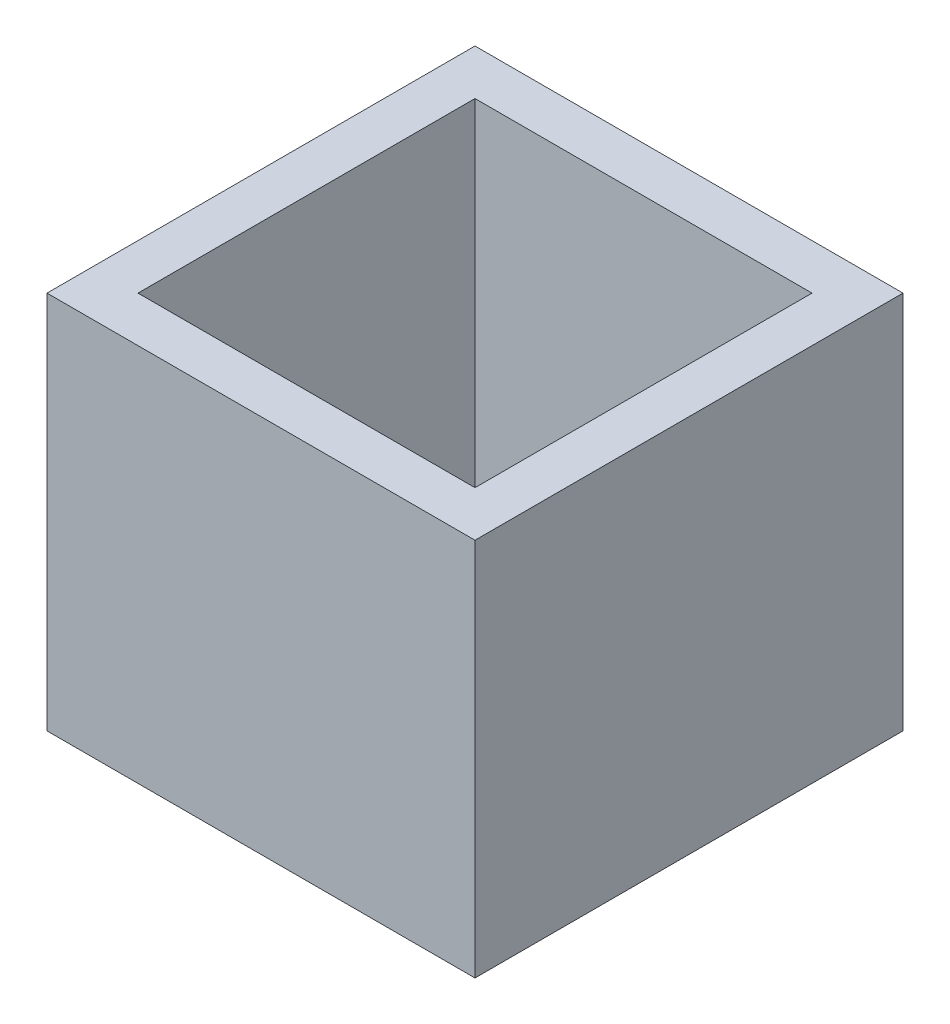
ISO-10303-21;
HEADER;
FILE_DESCRIPTION(('STEP AP214'),'2;1');
FILE_NAME('part.step','',(''),(''),'','','');
FILE_SCHEMA(('AUTOMOTIVE_DESIGN { 1 0 10303 214 1 1 1 1 }'));
ENDSEC;
DATA;
#1=APPLICATION_CONTEXT('core data for automotive mechanical design processes');
#2=APPLICATION_PROTOCOL_DEFINITION('international standard','automotive_design',2000,#1);
#3=PRODUCT_CONTEXT('',#1,'mechanical');
#4=PRODUCT('Part','Part','',(#3));
#5=PRODUCT_RELATED_PRODUCT_CATEGORY('part','',(#4));
#6=PRODUCT_DEFINITION_FORMATION('','',#4);
#7=PRODUCT_DEFINITION_CONTEXT('part definition',#1,'design');
#8=PRODUCT_DEFINITION('design','',#6,#7);
#9=PRODUCT_DEFINITION_SHAPE('','',#8);
#10=(LENGTH_UNIT() NAMED_UNIT(*) SI_UNIT(.MILLI.,.METRE.));
#11=(NAMED_UNIT(*) PLANE_ANGLE_UNIT() SI_UNIT($,.RADIAN.));
#12=(NAMED_UNIT(*) SI_UNIT($,.STERADIAN.) SOLID_ANGLE_UNIT());
#13=UNCERTAINTY_MEASURE_WITH_UNIT(LENGTH_MEASURE(1.E-05),#10,'distance_accuracy_value','');
#14=(GEOMETRIC_REPRESENTATION_CONTEXT(3) GLOBAL_UNCERTAINTY_ASSIGNED_CONTEXT((#13)) GLOBAL_UNIT_ASSIGNED_CONTEXT((#10,
#11,#12)) REPRESENTATION_CONTEXT('',''));
#15=CARTESIAN_POINT('',(0.,0.,0.));
#16=DIRECTION('',(0.,0.,1.));
#17=DIRECTION('',(1.,0.,0.));
#18=AXIS2_PLACEMENT_3D('',#15,#16,#17);
#19=CARTESIAN_POINT('',(10.16,18.,10.16));
#20=DIRECTION('',(-1.,0.,0.));
#21=DIRECTION('',(0.,0.,1.));
#22=AXIS2_PLACEMENT_3D('',#19,#20,#21);
#23=PLANE('',#22);
#24=DIRECTION('',(0.,0.,-1.));
#25=VECTOR('',#24,1.);
#26=CARTESIAN_POINT('',(10.16,0.,10.16));
#27=LINE('',#26,#25);
#28=CARTESIAN_POINT('',(10.16,0.,10.16));
#29=VERTEX_POINT('',#28);
#30=CARTESIAN_POINT('',(10.16,0.,-10.16));
#31=VERTEX_POINT('',#30);
#32=EDGE_CURVE('E143',#29,#31,#27,.T.);
#33=ORIENTED_EDGE('',*,*,#32,.T.);
#34=DIRECTION('',(0.,-1.,0.));
#35=VECTOR('',#34,1.);
#36=CARTESIAN_POINT('',(10.16,18.,-10.16));
#37=LINE('',#36,#35);
#38=CARTESIAN_POINT('',(10.16,18.,-10.16));
#39=VERTEX_POINT('',#38);
#40=EDGE_CURVE('E11',#39,#31,#37,.T.);
#41=ORIENTED_EDGE('',*,*,#40,.F.);
#42=DIRECTION('',(0.,0.,-1.));
#43=VECTOR('',#42,1.);
#44=CARTESIAN_POINT('',(10.16,18.,10.16));
#45=LINE('',#44,#43);
#46=CARTESIAN_POINT('',(10.16,18.,10.16));
#47=VERTEX_POINT('',#46);
#48=EDGE_CURVE('E147',#47,#39,#45,.T.);
#49=ORIENTED_EDGE('',*,*,#48,.F.);
#50=DIRECTION('',(0.,-1.,0.));
#51=VECTOR('',#50,1.);
#52=CARTESIAN_POINT('',(10.16,18.,10.16));
#53=LINE('',#52,#51);
#54=EDGE_CURVE('E153',#47,#29,#53,.T.);
#55=ORIENTED_EDGE('',*,*,#54,.T.);
#56=EDGE_LOOP('',(#33,#41,#49,#55));
#57=FACE_BOUND('',#56,.T.);
#58=ADVANCED_FACE('F35',(#57),#23,.F.);
#59=CARTESIAN_POINT('',(-10.16,18.,-10.16));
#60=DIRECTION('',(0.,0.,1.));
#61=DIRECTION('',(1.,0.,0.));
#62=AXIS2_PLACEMENT_3D('',#59,#60,#61);
#63=PLANE('',#62);
#64=DIRECTION('',(-1.,0.,0.));
#65=VECTOR('',#64,1.);
#66=CARTESIAN_POINT('',(-10.16,0.,-10.16));
#67=LINE('',#66,#65);
#68=CARTESIAN_POINT('',(-10.16,0.,-10.16));
#69=VERTEX_POINT('',#68);
#70=EDGE_CURVE('E156',#31,#69,#67,.T.);
#71=ORIENTED_EDGE('',*,*,#70,.T.);
#72=DIRECTION('',(0.,-1.,0.));
#73=VECTOR('',#72,1.);
#74=CARTESIAN_POINT('',(-10.16,18.,-10.16));
#75=LINE('',#74,#73);
#76=CARTESIAN_POINT('',(-10.16,18.,-10.16));
#77=VERTEX_POINT('',#76);
#78=EDGE_CURVE('E42',#77,#69,#75,.T.);
#79=ORIENTED_EDGE('',*,*,#78,.F.);
#80=DIRECTION('',(-1.,0.,0.));
#81=VECTOR('',#80,1.);
#82=CARTESIAN_POINT('',(-10.16,18.,-10.16));
#83=LINE('',#82,#81);
#84=EDGE_CURVE('E86',#39,#77,#83,.T.);
#85=ORIENTED_EDGE('',*,*,#84,.F.);
#86=ORIENTED_EDGE('',*,*,#40,.T.);
#87=EDGE_LOOP('',(#71,#79,#85,#86));
#88=FACE_BOUND('',#87,.T.);
#89=ADVANCED_FACE('F185',(#88),#63,.F.);
#90=CARTESIAN_POINT('',(-10.16,18.,10.16));
#91=DIRECTION('',(1.,0.,0.));
#92=DIRECTION('',(0.,0.,-1.));
#93=AXIS2_PLACEMENT_3D('',#90,#91,#92);
#94=PLANE('',#93);
#95=DIRECTION('',(0.,0.,1.));
#96=VECTOR('',#95,1.);
#97=CARTESIAN_POINT('',(-10.16,0.,10.16));
#98=LINE('',#97,#96);
#99=CARTESIAN_POINT('',(-10.16,0.,10.16));
#100=VERTEX_POINT('',#99);
#101=EDGE_CURVE('E158',#69,#100,#98,.T.);
#102=ORIENTED_EDGE('',*,*,#101,.T.);
#103=DIRECTION('',(0.,-1.,0.));
#104=VECTOR('',#103,1.);
#105=CARTESIAN_POINT('',(-10.16,18.,10.16));
#106=LINE('',#105,#104);
#107=CARTESIAN_POINT('',(-10.16,18.,10.16));
#108=VERTEX_POINT('',#107);
#109=EDGE_CURVE('E162',#108,#100,#106,.T.);
#110=ORIENTED_EDGE('',*,*,#109,.F.);
#111=DIRECTION('',(0.,0.,1.));
#112=VECTOR('',#111,1.);
#113=CARTESIAN_POINT('',(-10.16,18.,10.16));
#114=LINE('',#113,#112);
#115=EDGE_CURVE('E150',#77,#108,#114,.T.);
#116=ORIENTED_EDGE('',*,*,#115,.F.);
#117=ORIENTED_EDGE('',*,*,#78,.T.);
#118=EDGE_LOOP('',(#102,#110,#116,#117));
#119=FACE_BOUND('',#118,.T.);
#120=ADVANCED_FACE('F167',(#119),#94,.F.);
#121=CARTESIAN_POINT('',(-10.16,18.,10.16));
#122=DIRECTION('',(0.,0.,-1.));
#123=DIRECTION('',(-1.,0.,0.));
#124=AXIS2_PLACEMENT_3D('',#121,#122,#123);
#125=PLANE('',#124);
#126=DIRECTION('',(1.,0.,0.));
#127=VECTOR('',#126,1.);
#128=CARTESIAN_POINT('',(-10.16,0.,10.16));
#129=LINE('',#128,#127);
#130=EDGE_CURVE('E79',#100,#29,#129,.T.);
#131=ORIENTED_EDGE('',*,*,#130,.T.);
#132=ORIENTED_EDGE('',*,*,#54,.F.);
#133=DIRECTION('',(1.,0.,0.));
#134=VECTOR('',#133,1.);
#135=CARTESIAN_POINT('',(-10.16,18.,10.16));
#136=LINE('',#135,#134);
#137=EDGE_CURVE('E58',#108,#47,#136,.T.);
#138=ORIENTED_EDGE('',*,*,#137,.F.);
#139=ORIENTED_EDGE('',*,*,#109,.T.);
#140=EDGE_LOOP('',(#131,#132,#138,#139));
#141=FACE_BOUND('',#140,.T.);
#142=ADVANCED_FACE('F175',(#141),#125,.F.);
#143=CARTESIAN_POINT('',(0.,18.,0.));
#144=DIRECTION('',(0.,-1.,0.));
#145=DIRECTION('',(0.,0.,-1.));
#146=AXIS2_PLACEMENT_3D('',#143,#144,#145);
#147=PLANE('',#146);
#148=DIRECTION('',(-1.,0.,0.));
#149=VECTOR('',#148,1.);
#150=CARTESIAN_POINT('',(-7.999999986,18.,-8.000000018));
#151=LINE('',#150,#149);
#152=CARTESIAN_POINT('',(7.999999986,18.,-8.000000018));
#153=VERTEX_POINT('',#152);
#154=CARTESIAN_POINT('',(-7.999999986,18.,-8.000000018));
#155=VERTEX_POINT('',#154);
#156=EDGE_CURVE('E137',#153,#155,#151,.T.);
#157=ORIENTED_EDGE('',*,*,#156,.F.);
#158=DIRECTION('',(0.,0.,-1.));
#159=VECTOR('',#158,1.);
#160=CARTESIAN_POINT('',(7.999999986,18.,8.000000018));
#161=LINE('',#160,#159);
#162=CARTESIAN_POINT('',(7.999999986,18.,8.000000018));
#163=VERTEX_POINT('',#162);
#164=EDGE_CURVE('E49',#163,#153,#161,.T.);
#165=ORIENTED_EDGE('',*,*,#164,.F.);
#166=DIRECTION('',(1.,0.,0.));
#167=VECTOR('',#166,1.);
#168=CARTESIAN_POINT('',(-7.999999986,18.,8.000000018));
#169=LINE('',#168,#167);
#170=CARTESIAN_POINT('',(-7.999999986,18.,8.000000018));
#171=VERTEX_POINT('',#170);
#172=EDGE_CURVE('E128',#171,#163,#169,.T.);
#173=ORIENTED_EDGE('',*,*,#172,.F.);
#174=DIRECTION('',(0.,0.,1.));
#175=VECTOR('',#174,1.);
#176=CARTESIAN_POINT('',(-7.999999986,18.,8.000000018));
#177=LINE('',#176,#175);
#178=EDGE_CURVE('E131',#155,#171,#177,.T.);
#179=ORIENTED_EDGE('',*,*,#178,.F.);
#180=EDGE_LOOP('',(#157,#165,#173,#179));
#181=FACE_BOUND('',#180,.T.);
#182=ORIENTED_EDGE('',*,*,#48,.T.);
#183=ORIENTED_EDGE('',*,*,#84,.T.);
#184=ORIENTED_EDGE('',*,*,#115,.T.);
#185=ORIENTED_EDGE('',*,*,#137,.T.);
#186=EDGE_LOOP('',(#182,#183,#184,#185));
#187=FACE_BOUND('',#186,.T.);
#188=ADVANCED_FACE('F177',(#181,#187),#147,.F.);
#189=CARTESIAN_POINT('',(0.,0.,0.));
#190=DIRECTION('',(0.,-1.,0.));
#191=DIRECTION('',(0.,0.,-1.));
#192=AXIS2_PLACEMENT_3D('',#189,#190,#191);
#193=PLANE('',#192);
#194=ORIENTED_EDGE('',*,*,#32,.F.);
#195=ORIENTED_EDGE('',*,*,#130,.F.);
#196=ORIENTED_EDGE('',*,*,#101,.F.);
#197=ORIENTED_EDGE('',*,*,#70,.F.);
#198=EDGE_LOOP('',(#194,#195,#196,#197));
#199=FACE_BOUND('',#198,.T.);
#200=ADVANCED_FACE('F171',(#199),#193,.T.);
#201=CARTESIAN_POINT('',(7.999999986,1.5,8.000000018));
#202=DIRECTION('',(1.,0.,0.));
#203=DIRECTION('',(0.,0.,-1.));
#204=AXIS2_PLACEMENT_3D('',#201,#202,#203);
#205=PLANE('',#204);
#206=ORIENTED_EDGE('',*,*,#164,.T.);
#207=DIRECTION('',(0.,1.,0.));
#208=VECTOR('',#207,1.);
#209=CARTESIAN_POINT('',(7.999999986,1.5,-8.000000018));
#210=LINE('',#209,#208);
#211=CARTESIAN_POINT('',(7.999999986,1.5,-8.000000018));
#212=VERTEX_POINT('',#211);
#213=EDGE_CURVE('E106',#212,#153,#210,.T.);
#214=ORIENTED_EDGE('',*,*,#213,.F.);
#215=DIRECTION('',(0.,0.,-1.));
#216=VECTOR('',#215,1.);
#217=CARTESIAN_POINT('',(7.999999986,1.5,8.000000018));
#218=LINE('',#217,#216);
#219=CARTESIAN_POINT('',(7.999999986,1.5,8.000000018));
#220=VERTEX_POINT('',#219);
#221=EDGE_CURVE('E110',#220,#212,#218,.T.);
#222=ORIENTED_EDGE('',*,*,#221,.F.);
#223=DIRECTION('',(0.,1.,0.));
#224=VECTOR('',#223,1.);
#225=CARTESIAN_POINT('',(7.999999986,1.5,8.000000018));
#226=LINE('',#225,#224);
#227=EDGE_CURVE('E141',#220,#163,#226,.T.);
#228=ORIENTED_EDGE('',*,*,#227,.T.);
#229=EDGE_LOOP('',(#206,#214,#222,#228));
#230=FACE_BOUND('',#229,.T.);
#231=ADVANCED_FACE('F108',(#230),#205,.F.);
#232=CARTESIAN_POINT('',(-7.999999986,1.5,8.000000018));
#233=DIRECTION('',(0.,0.,1.));
#234=DIRECTION('',(1.,0.,0.));
#235=AXIS2_PLACEMENT_3D('',#232,#233,#234);
#236=PLANE('',#235);
#237=ORIENTED_EDGE('',*,*,#172,.T.);
#238=ORIENTED_EDGE('',*,*,#227,.F.);
#239=DIRECTION('',(1.,0.,0.));
#240=VECTOR('',#239,1.);
#241=CARTESIAN_POINT('',(-7.999999986,1.5,8.000000018));
#242=LINE('',#241,#240);
#243=CARTESIAN_POINT('',(-7.999999986,1.5,8.000000018));
#244=VERTEX_POINT('',#243);
#245=EDGE_CURVE('E116',#244,#220,#242,.T.);
#246=ORIENTED_EDGE('',*,*,#245,.F.);
#247=DIRECTION('',(0.,1.,0.));
#248=VECTOR('',#247,1.);
#249=CARTESIAN_POINT('',(-7.999999986,1.5,8.000000018));
#250=LINE('',#249,#248);
#251=EDGE_CURVE('E144',#244,#171,#250,.T.);
#252=ORIENTED_EDGE('',*,*,#251,.T.);
#253=EDGE_LOOP('',(#237,#238,#246,#252));
#254=FACE_BOUND('',#253,.T.);
#255=ADVANCED_FACE('F224',(#254),#236,.F.);
#256=CARTESIAN_POINT('',(-7.999999986,1.5,8.000000018));
#257=DIRECTION('',(-1.,0.,0.));
#258=DIRECTION('',(0.,0.,1.));
#259=AXIS2_PLACEMENT_3D('',#256,#257,#258);
#260=PLANE('',#259);
#261=ORIENTED_EDGE('',*,*,#178,.T.);
#262=ORIENTED_EDGE('',*,*,#251,.F.);
#263=DIRECTION('',(0.,0.,1.));
#264=VECTOR('',#263,1.);
#265=CARTESIAN_POINT('',(-7.999999986,1.5,8.000000018));
#266=LINE('',#265,#264);
#267=CARTESIAN_POINT('',(-7.999999986,1.5,-8.000000018));
#268=VERTEX_POINT('',#267);
#269=EDGE_CURVE('E124',#268,#244,#266,.T.);
#270=ORIENTED_EDGE('',*,*,#269,.F.);
#271=DIRECTION('',(0.,1.,0.));
#272=VECTOR('',#271,1.);
#273=CARTESIAN_POINT('',(-7.999999986,1.5,-8.000000018));
#274=LINE('',#273,#272);
#275=EDGE_CURVE('E115',#268,#155,#274,.T.);
#276=ORIENTED_EDGE('',*,*,#275,.T.);
#277=EDGE_LOOP('',(#261,#262,#270,#276));
#278=FACE_BOUND('',#277,.T.);
#279=ADVANCED_FACE('F233',(#278),#260,.F.);
#280=CARTESIAN_POINT('',(-7.999999986,1.5,-8.000000018));
#281=DIRECTION('',(0.,0.,-1.));
#282=DIRECTION('',(-1.,0.,0.));
#283=AXIS2_PLACEMENT_3D('',#280,#281,#282);
#284=PLANE('',#283);
#285=ORIENTED_EDGE('',*,*,#156,.T.);
#286=ORIENTED_EDGE('',*,*,#275,.F.);
#287=DIRECTION('',(-1.,0.,0.));
#288=VECTOR('',#287,1.);
#289=CARTESIAN_POINT('',(-7.999999986,1.5,-8.000000018));
#290=LINE('',#289,#288);
#291=EDGE_CURVE('E119',#212,#268,#290,.T.);
#292=ORIENTED_EDGE('',*,*,#291,.F.);
#293=ORIENTED_EDGE('',*,*,#213,.T.);
#294=EDGE_LOOP('',(#285,#286,#292,#293));
#295=FACE_BOUND('',#294,.T.);
#296=ADVANCED_FACE('F120',(#295),#284,.F.);
#297=CARTESIAN_POINT('',(0.,1.5,0.));
#298=DIRECTION('',(0.,-1.,0.));
#299=DIRECTION('',(0.,0.,-1.));
#300=AXIS2_PLACEMENT_3D('',#297,#298,#299);
#301=PLANE('',#300);
#302=ORIENTED_EDGE('',*,*,#221,.T.);
#303=ORIENTED_EDGE('',*,*,#291,.T.);
#304=ORIENTED_EDGE('',*,*,#269,.T.);
#305=ORIENTED_EDGE('',*,*,#245,.T.);
#306=EDGE_LOOP('',(#302,#303,#304,#305));
#307=FACE_BOUND('',#306,.T.);
#308=ADVANCED_FACE('F126',(#307),#301,.F.);
#309=CLOSED_SHELL('',(#58,#89,#120,#142,#188,#200,#231,#255,#279,#296,#308));
#310=MANIFOLD_SOLID_BREP('B2',#309);
#311=ADVANCED_BREP_SHAPE_REPRESENTATION('',(#18,#310),#14);
#312=SHAPE_DEFINITION_REPRESENTATION(#9,#311);
ENDSEC;
END-ISO-10303-21;
